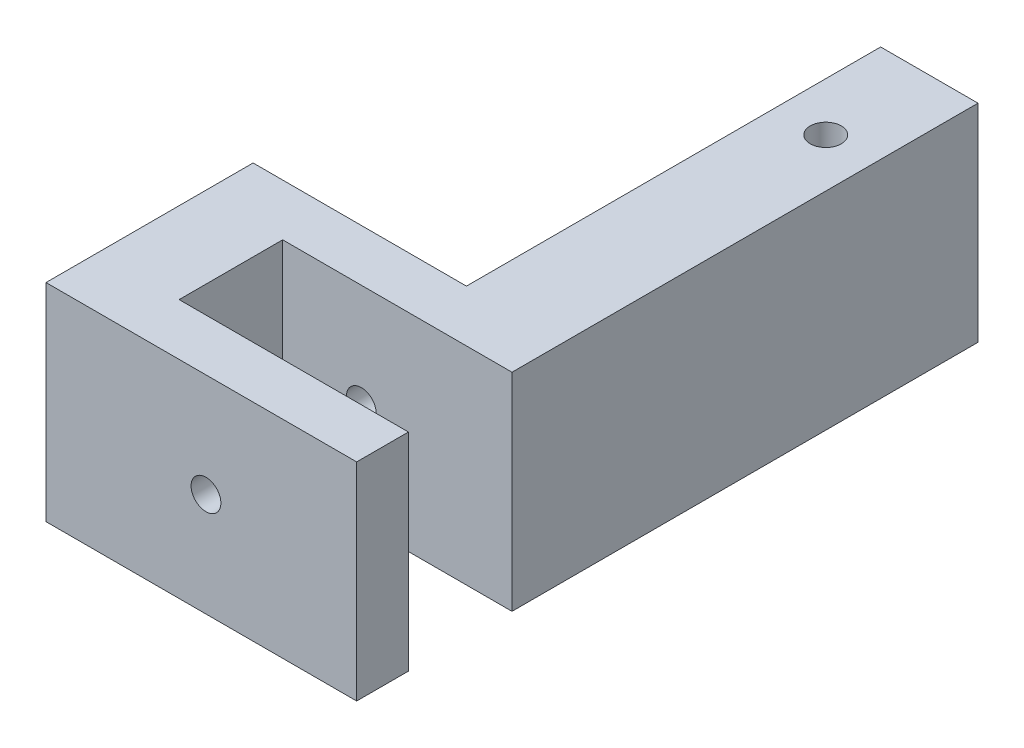
ISO-10303-21;
HEADER;
FILE_DESCRIPTION(('STEP AP214'),'2;1');
FILE_NAME('part.step','',(''),(''),'','','');
FILE_SCHEMA(('AUTOMOTIVE_DESIGN { 1 0 10303 214 1 1 1 1 }'));
ENDSEC;
DATA;
#1=APPLICATION_CONTEXT('core data for automotive mechanical design processes');
#2=APPLICATION_PROTOCOL_DEFINITION('international standard','automotive_design',2000,#1);
#3=PRODUCT_CONTEXT('',#1,'mechanical');
#4=PRODUCT('Part','Part','',(#3));
#5=PRODUCT_RELATED_PRODUCT_CATEGORY('part','',(#4));
#6=PRODUCT_DEFINITION_FORMATION('','',#4);
#7=PRODUCT_DEFINITION_CONTEXT('part definition',#1,'design');
#8=PRODUCT_DEFINITION('design','',#6,#7);
#9=PRODUCT_DEFINITION_SHAPE('','',#8);
#10=(LENGTH_UNIT() NAMED_UNIT(*) SI_UNIT(.MILLI.,.METRE.));
#11=(NAMED_UNIT(*) PLANE_ANGLE_UNIT() SI_UNIT($,.RADIAN.));
#12=(NAMED_UNIT(*) SI_UNIT($,.STERADIAN.) SOLID_ANGLE_UNIT());
#13=UNCERTAINTY_MEASURE_WITH_UNIT(LENGTH_MEASURE(1.E-05),#10,'distance_accuracy_value','');
#14=(GEOMETRIC_REPRESENTATION_CONTEXT(3) GLOBAL_UNCERTAINTY_ASSIGNED_CONTEXT((#13)) GLOBAL_UNIT_ASSIGNED_CONTEXT((#10,
#11,#12)) REPRESENTATION_CONTEXT('',''));
#15=CARTESIAN_POINT('',(0.,0.,0.));
#16=DIRECTION('',(0.,0.,1.));
#17=DIRECTION('',(1.,0.,0.));
#18=AXIS2_PLACEMENT_3D('',#15,#16,#17);
#19=CARTESIAN_POINT('',(0.,25.4,0.));
#20=DIRECTION('',(0.,1.,0.));
#21=DIRECTION('',(0.,0.,1.));
#22=AXIS2_PLACEMENT_3D('',#19,#20,#21);
#23=PLANE('',#22);
#24=DIRECTION('',(0.,0.,-1.));
#25=VECTOR('',#24,1.);
#26=CARTESIAN_POINT('',(0.,25.4,6.35));
#27=LINE('',#26,#25);
#28=CARTESIAN_POINT('',(0.,25.4,6.35));
#29=VERTEX_POINT('',#28);
#30=CARTESIAN_POINT('',(0.,25.4,0.));
#31=VERTEX_POINT('',#30);
#32=EDGE_CURVE('E182',#29,#31,#27,.T.);
#33=ORIENTED_EDGE('',*,*,#32,.T.);
#34=DIRECTION('',(-1.,0.,0.));
#35=VECTOR('',#34,1.);
#36=CARTESIAN_POINT('',(0.,25.4,0.));
#37=LINE('',#36,#35);
#38=CARTESIAN_POINT('',(-28.1242902208202,25.4,0.));
#39=VERTEX_POINT('',#38);
#40=EDGE_CURVE('E104',#31,#39,#37,.T.);
#41=ORIENTED_EDGE('',*,*,#40,.T.);
#42=DIRECTION('',(0.,0.,-1.));
#43=VECTOR('',#42,1.);
#44=CARTESIAN_POINT('',(-28.1242902208202,25.4,0.));
#45=LINE('',#44,#43);
#46=CARTESIAN_POINT('',(-28.1242902208202,25.4,-12.7));
#47=VERTEX_POINT('',#46);
#48=EDGE_CURVE('E211',#39,#47,#45,.T.);
#49=ORIENTED_EDGE('',*,*,#48,.T.);
#50=DIRECTION('',(1.,0.,0.));
#51=VECTOR('',#50,1.);
#52=CARTESIAN_POINT('',(-28.1242902208202,25.4,-12.7));
#53=LINE('',#52,#51);
#54=CARTESIAN_POINT('',(0.,25.4,-12.7));
#55=VERTEX_POINT('',#54);
#56=EDGE_CURVE('E230',#47,#55,#53,.T.);
#57=ORIENTED_EDGE('',*,*,#56,.T.);
#58=DIRECTION('',(0.,0.,-1.));
#59=VECTOR('',#58,1.);
#60=CARTESIAN_POINT('',(0.,25.4,-12.7));
#61=LINE('',#60,#59);
#62=CARTESIAN_POINT('',(0.,25.4,-69.85));
#63=VERTEX_POINT('',#62);
#64=EDGE_CURVE('E226',#55,#63,#61,.T.);
#65=ORIENTED_EDGE('',*,*,#64,.T.);
#66=DIRECTION('',(-1.,0.,0.));
#67=VECTOR('',#66,1.);
#68=CARTESIAN_POINT('',(-11.9388012618297,25.4,-69.85));
#69=LINE('',#68,#67);
#70=CARTESIAN_POINT('',(-11.9388012618297,25.4,-69.85));
#71=VERTEX_POINT('',#70);
#72=EDGE_CURVE('E229',#63,#71,#69,.T.);
#73=ORIENTED_EDGE('',*,*,#72,.T.);
#74=DIRECTION('',(0.,0.,1.));
#75=VECTOR('',#74,1.);
#76=CARTESIAN_POINT('',(-11.9388012618297,25.4,-19.05));
#77=LINE('',#76,#75);
#78=CARTESIAN_POINT('',(-11.9388012618297,25.4,-19.05));
#79=VERTEX_POINT('',#78);
#80=EDGE_CURVE('E129',#71,#79,#77,.T.);
#81=ORIENTED_EDGE('',*,*,#80,.T.);
#82=DIRECTION('',(-1.,0.,0.));
#83=VECTOR('',#82,1.);
#84=CARTESIAN_POINT('',(-38.1,25.4,-19.05));
#85=LINE('',#84,#83);
#86=CARTESIAN_POINT('',(-38.1,25.4,-19.05));
#87=VERTEX_POINT('',#86);
#88=EDGE_CURVE('E123',#79,#87,#85,.T.);
#89=ORIENTED_EDGE('',*,*,#88,.T.);
#90=DIRECTION('',(0.,0.,1.));
#91=VECTOR('',#90,1.);
#92=CARTESIAN_POINT('',(-38.1,25.4,-19.05));
#93=LINE('',#92,#91);
#94=CARTESIAN_POINT('',(-38.1,25.4,6.35));
#95=VERTEX_POINT('',#94);
#96=EDGE_CURVE('E127',#87,#95,#93,.T.);
#97=ORIENTED_EDGE('',*,*,#96,.T.);
#98=DIRECTION('',(1.,0.,0.));
#99=VECTOR('',#98,1.);
#100=CARTESIAN_POINT('',(-38.1,25.4,6.35));
#101=LINE('',#100,#99);
#102=EDGE_CURVE('E56',#95,#29,#101,.T.);
#103=ORIENTED_EDGE('',*,*,#102,.T.);
#104=EDGE_LOOP('',(#33,#41,#49,#57,#65,#73,#81,#89,#97,#103));
#105=FACE_BOUND('',#104,.T.);
#106=CARTESIAN_POINT('',(-5.96940063091483,25.4,-57.15));
#107=DIRECTION('',(0.,1.,0.));
#108=DIRECTION('',(0.,0.,1.));
#109=AXIS2_PLACEMENT_3D('',#106,#107,#108);
#110=CIRCLE('',#109,1.905);
#111=CARTESIAN_POINT('',(-5.96940063091483,25.4,-55.245));
#112=VERTEX_POINT('',#111);
#113=EDGE_CURVE('E157',#112,#112,#110,.T.);
#114=ORIENTED_EDGE('',*,*,#113,.F.);
#115=EDGE_LOOP('',(#114));
#116=FACE_BOUND('',#115,.T.);
#117=ADVANCED_FACE('F38',(#105,#116),#23,.T.);
#118=CARTESIAN_POINT('',(0.,0.,0.));
#119=DIRECTION('',(0.,1.,0.));
#120=DIRECTION('',(0.,0.,1.));
#121=AXIS2_PLACEMENT_3D('',#118,#119,#120);
#122=PLANE('',#121);
#123=DIRECTION('',(0.,0.,-1.));
#124=VECTOR('',#123,1.);
#125=CARTESIAN_POINT('',(0.,0.,6.35));
#126=LINE('',#125,#124);
#127=CARTESIAN_POINT('',(0.,0.,6.35));
#128=VERTEX_POINT('',#127);
#129=CARTESIAN_POINT('',(0.,0.,0.));
#130=VERTEX_POINT('',#129);
#131=EDGE_CURVE('E152',#128,#130,#126,.T.);
#132=ORIENTED_EDGE('',*,*,#131,.F.);
#133=DIRECTION('',(1.,0.,0.));
#134=VECTOR('',#133,1.);
#135=CARTESIAN_POINT('',(-38.1,0.,6.35));
#136=LINE('',#135,#134);
#137=CARTESIAN_POINT('',(-38.1,0.,6.35));
#138=VERTEX_POINT('',#137);
#139=EDGE_CURVE('E96',#138,#128,#136,.T.);
#140=ORIENTED_EDGE('',*,*,#139,.F.);
#141=DIRECTION('',(0.,0.,1.));
#142=VECTOR('',#141,1.);
#143=CARTESIAN_POINT('',(-38.1,0.,-7.03107255520506));
#144=LINE('',#143,#142);
#145=CARTESIAN_POINT('',(-38.1,0.,-19.05));
#146=VERTEX_POINT('',#145);
#147=EDGE_CURVE('E90',#146,#138,#144,.T.);
#148=ORIENTED_EDGE('',*,*,#147,.F.);
#149=DIRECTION('',(-1.,0.,0.));
#150=VECTOR('',#149,1.);
#151=CARTESIAN_POINT('',(-38.1,0.,-19.05));
#152=LINE('',#151,#150);
#153=CARTESIAN_POINT('',(-11.9388012618297,0.,-19.05));
#154=VERTEX_POINT('',#153);
#155=EDGE_CURVE('E139',#154,#146,#152,.T.);
#156=ORIENTED_EDGE('',*,*,#155,.F.);
#157=DIRECTION('',(0.,0.,1.));
#158=VECTOR('',#157,1.);
#159=CARTESIAN_POINT('',(-11.9388012618297,0.,-19.05));
#160=LINE('',#159,#158);
#161=CARTESIAN_POINT('',(-11.9388012618297,0.,-69.85));
#162=VERTEX_POINT('',#161);
#163=EDGE_CURVE('E173',#162,#154,#160,.T.);
#164=ORIENTED_EDGE('',*,*,#163,.F.);
#165=DIRECTION('',(-1.,0.,0.));
#166=VECTOR('',#165,1.);
#167=CARTESIAN_POINT('',(-11.9388012618297,0.,-69.85));
#168=LINE('',#167,#166);
#169=CARTESIAN_POINT('',(0.,0.,-69.85));
#170=VERTEX_POINT('',#169);
#171=EDGE_CURVE('E170',#170,#162,#168,.T.);
#172=ORIENTED_EDGE('',*,*,#171,.F.);
#173=DIRECTION('',(0.,0.,-1.));
#174=VECTOR('',#173,1.);
#175=CARTESIAN_POINT('',(0.,0.,-69.85));
#176=LINE('',#175,#174);
#177=CARTESIAN_POINT('',(0.,0.,-12.7));
#178=VERTEX_POINT('',#177);
#179=EDGE_CURVE('E167',#178,#170,#176,.T.);
#180=ORIENTED_EDGE('',*,*,#179,.F.);
#181=DIRECTION('',(1.,0.,0.));
#182=VECTOR('',#181,1.);
#183=CARTESIAN_POINT('',(-28.1242902208202,0.,-12.7));
#184=LINE('',#183,#182);
#185=CARTESIAN_POINT('',(-28.1242902208202,0.,-12.7));
#186=VERTEX_POINT('',#185);
#187=EDGE_CURVE('E163',#186,#178,#184,.T.);
#188=ORIENTED_EDGE('',*,*,#187,.F.);
#189=DIRECTION('',(0.,0.,-1.));
#190=VECTOR('',#189,1.);
#191=CARTESIAN_POINT('',(-28.1242902208202,0.,0.));
#192=LINE('',#191,#190);
#193=CARTESIAN_POINT('',(-28.1242902208202,0.,0.));
#194=VERTEX_POINT('',#193);
#195=EDGE_CURVE('E160',#194,#186,#192,.T.);
#196=ORIENTED_EDGE('',*,*,#195,.F.);
#197=DIRECTION('',(-1.,0.,0.));
#198=VECTOR('',#197,1.);
#199=CARTESIAN_POINT('',(0.,0.,0.));
#200=LINE('',#199,#198);
#201=EDGE_CURVE('E156',#130,#194,#200,.T.);
#202=ORIENTED_EDGE('',*,*,#201,.F.);
#203=EDGE_LOOP('',(#132,#140,#148,#156,#164,#172,#180,#188,#196,#202));
#204=FACE_BOUND('',#203,.T.);
#205=CARTESIAN_POINT('',(-5.96940063091483,0.,-57.15));
#206=DIRECTION('',(0.,1.,0.));
#207=DIRECTION('',(0.,0.,1.));
#208=AXIS2_PLACEMENT_3D('',#205,#206,#207);
#209=CIRCLE('',#208,1.905);
#210=CARTESIAN_POINT('',(-5.96940063091483,0.,-55.245));
#211=VERTEX_POINT('',#210);
#212=EDGE_CURVE('E244',#211,#211,#209,.T.);
#213=ORIENTED_EDGE('',*,*,#212,.T.);
#214=EDGE_LOOP('',(#213));
#215=FACE_BOUND('',#214,.T.);
#216=ADVANCED_FACE('F215',(#204,#215),#122,.F.);
#217=CARTESIAN_POINT('',(0.,25.4,6.35));
#218=DIRECTION('',(-1.,0.,0.));
#219=DIRECTION('',(0.,0.,1.));
#220=AXIS2_PLACEMENT_3D('',#217,#218,#219);
#221=PLANE('',#220);
#222=ORIENTED_EDGE('',*,*,#131,.T.);
#223=DIRECTION('',(0.,-1.,0.));
#224=VECTOR('',#223,1.);
#225=CARTESIAN_POINT('',(0.,25.4,0.));
#226=LINE('',#225,#224);
#227=EDGE_CURVE('E11',#31,#130,#226,.T.);
#228=ORIENTED_EDGE('',*,*,#227,.F.);
#229=ORIENTED_EDGE('',*,*,#32,.F.);
#230=DIRECTION('',(0.,-1.,0.));
#231=VECTOR('',#230,1.);
#232=CARTESIAN_POINT('',(0.,25.4,6.35));
#233=LINE('',#232,#231);
#234=EDGE_CURVE('E148',#29,#128,#233,.T.);
#235=ORIENTED_EDGE('',*,*,#234,.T.);
#236=EDGE_LOOP('',(#222,#228,#229,#235));
#237=FACE_BOUND('',#236,.T.);
#238=ADVANCED_FACE('F40',(#237),#221,.F.);
#239=CARTESIAN_POINT('',(0.,25.4,0.));
#240=DIRECTION('',(0.,0.,1.));
#241=DIRECTION('',(1.,0.,0.));
#242=AXIS2_PLACEMENT_3D('',#239,#240,#241);
#243=PLANE('',#242);
#244=CARTESIAN_POINT('',(-18.4791009463723,12.7,0.));
#245=DIRECTION('',(0.,0.,1.));
#246=DIRECTION('',(1.,0.,0.));
#247=AXIS2_PLACEMENT_3D('',#244,#245,#246);
#248=CIRCLE('',#247,1.82879999999999);
#249=CARTESIAN_POINT('',(-16.6503009463723,12.7,0.));
#250=VERTEX_POINT('',#249);
#251=EDGE_CURVE('E248',#250,#250,#248,.T.);
#252=ORIENTED_EDGE('',*,*,#251,.T.);
#253=EDGE_LOOP('',(#252));
#254=FACE_BOUND('',#253,.T.);
#255=ORIENTED_EDGE('',*,*,#201,.T.);
#256=DIRECTION('',(0.,-1.,0.));
#257=VECTOR('',#256,1.);
#258=CARTESIAN_POINT('',(-28.1242902208202,25.4,0.));
#259=LINE('',#258,#257);
#260=EDGE_CURVE('E48',#39,#194,#259,.T.);
#261=ORIENTED_EDGE('',*,*,#260,.F.);
#262=ORIENTED_EDGE('',*,*,#40,.F.);
#263=ORIENTED_EDGE('',*,*,#227,.T.);
#264=EDGE_LOOP('',(#255,#261,#262,#263));
#265=FACE_BOUND('',#264,.T.);
#266=ADVANCED_FACE('F310',(#254,#265),#243,.F.);
#267=CARTESIAN_POINT('',(-28.1242902208202,25.4,0.));
#268=DIRECTION('',(-1.,0.,0.));
#269=DIRECTION('',(0.,0.,1.));
#270=AXIS2_PLACEMENT_3D('',#267,#268,#269);
#271=PLANE('',#270);
#272=ORIENTED_EDGE('',*,*,#195,.T.);
#273=DIRECTION('',(0.,-1.,0.));
#274=VECTOR('',#273,1.);
#275=CARTESIAN_POINT('',(-28.1242902208202,25.4,-12.7));
#276=LINE('',#275,#274);
#277=EDGE_CURVE('E201',#47,#186,#276,.T.);
#278=ORIENTED_EDGE('',*,*,#277,.F.);
#279=ORIENTED_EDGE('',*,*,#48,.F.);
#280=ORIENTED_EDGE('',*,*,#260,.T.);
#281=EDGE_LOOP('',(#272,#278,#279,#280));
#282=FACE_BOUND('',#281,.T.);
#283=ADVANCED_FACE('F209',(#282),#271,.F.);
#284=CARTESIAN_POINT('',(-28.1242902208202,25.4,-12.7));
#285=DIRECTION('',(0.,0.,-1.));
#286=DIRECTION('',(-1.,0.,0.));
#287=AXIS2_PLACEMENT_3D('',#284,#285,#286);
#288=PLANE('',#287);
#289=CARTESIAN_POINT('',(-18.4791009463723,12.7,-12.7));
#290=DIRECTION('',(0.,0.,-1.));
#291=DIRECTION('',(-1.,0.,0.));
#292=AXIS2_PLACEMENT_3D('',#289,#290,#291);
#293=CIRCLE('',#292,1.82879999999999);
#294=CARTESIAN_POINT('',(-20.3079009463722,12.7,-12.7));
#295=VERTEX_POINT('',#294);
#296=EDGE_CURVE('E255',#295,#295,#293,.T.);
#297=ORIENTED_EDGE('',*,*,#296,.T.);
#298=EDGE_LOOP('',(#297));
#299=FACE_BOUND('',#298,.T.);
#300=ORIENTED_EDGE('',*,*,#187,.T.);
#301=DIRECTION('',(0.,-1.,0.));
#302=VECTOR('',#301,1.);
#303=CARTESIAN_POINT('',(0.,25.4,-12.7));
#304=LINE('',#303,#302);
#305=EDGE_CURVE('E197',#55,#178,#304,.T.);
#306=ORIENTED_EDGE('',*,*,#305,.F.);
#307=ORIENTED_EDGE('',*,*,#56,.F.);
#308=ORIENTED_EDGE('',*,*,#277,.T.);
#309=EDGE_LOOP('',(#300,#306,#307,#308));
#310=FACE_BOUND('',#309,.T.);
#311=ADVANCED_FACE('F220',(#299,#310),#288,.F.);
#312=CARTESIAN_POINT('',(0.,25.4,-69.85));
#313=DIRECTION('',(-1.,0.,0.));
#314=DIRECTION('',(0.,0.,1.));
#315=AXIS2_PLACEMENT_3D('',#312,#313,#314);
#316=PLANE('',#315);
#317=ORIENTED_EDGE('',*,*,#179,.T.);
#318=DIRECTION('',(0.,-1.,0.));
#319=VECTOR('',#318,1.);
#320=CARTESIAN_POINT('',(0.,25.4,-69.85));
#321=LINE('',#320,#319);
#322=EDGE_CURVE('E193',#63,#170,#321,.T.);
#323=ORIENTED_EDGE('',*,*,#322,.F.);
#324=ORIENTED_EDGE('',*,*,#64,.F.);
#325=ORIENTED_EDGE('',*,*,#305,.T.);
#326=EDGE_LOOP('',(#317,#323,#324,#325));
#327=FACE_BOUND('',#326,.T.);
#328=ADVANCED_FACE('F224',(#327),#316,.F.);
#329=CARTESIAN_POINT('',(-11.9388012618297,25.4,-69.85));
#330=DIRECTION('',(0.,0.,1.));
#331=DIRECTION('',(1.,0.,0.));
#332=AXIS2_PLACEMENT_3D('',#329,#330,#331);
#333=PLANE('',#332);
#334=ORIENTED_EDGE('',*,*,#171,.T.);
#335=DIRECTION('',(0.,-1.,0.));
#336=VECTOR('',#335,1.);
#337=CARTESIAN_POINT('',(-11.9388012618297,25.4,-69.85));
#338=LINE('',#337,#336);
#339=EDGE_CURVE('E189',#71,#162,#338,.T.);
#340=ORIENTED_EDGE('',*,*,#339,.F.);
#341=ORIENTED_EDGE('',*,*,#72,.F.);
#342=ORIENTED_EDGE('',*,*,#322,.T.);
#343=EDGE_LOOP('',(#334,#340,#341,#342));
#344=FACE_BOUND('',#343,.T.);
#345=ADVANCED_FACE('F283',(#344),#333,.F.);
#346=CARTESIAN_POINT('',(-11.9388012618297,25.4,-19.05));
#347=DIRECTION('',(1.,0.,0.));
#348=DIRECTION('',(0.,0.,-1.));
#349=AXIS2_PLACEMENT_3D('',#346,#347,#348);
#350=PLANE('',#349);
#351=ORIENTED_EDGE('',*,*,#163,.T.);
#352=DIRECTION('',(0.,-1.,0.));
#353=VECTOR('',#352,1.);
#354=CARTESIAN_POINT('',(-11.9388012618297,25.4,-19.05));
#355=LINE('',#354,#353);
#356=EDGE_CURVE('E141',#79,#154,#355,.T.);
#357=ORIENTED_EDGE('',*,*,#356,.F.);
#358=ORIENTED_EDGE('',*,*,#80,.F.);
#359=ORIENTED_EDGE('',*,*,#339,.T.);
#360=EDGE_LOOP('',(#351,#357,#358,#359));
#361=FACE_BOUND('',#360,.T.);
#362=ADVANCED_FACE('F275',(#361),#350,.F.);
#363=CARTESIAN_POINT('',(-38.1,25.4,-19.05));
#364=DIRECTION('',(0.,0.,1.));
#365=DIRECTION('',(1.,0.,0.));
#366=AXIS2_PLACEMENT_3D('',#363,#364,#365);
#367=PLANE('',#366);
#368=CARTESIAN_POINT('',(-18.4791009463723,12.7,-19.05));
#369=DIRECTION('',(0.,0.,-1.));
#370=DIRECTION('',(-1.,0.,0.));
#371=AXIS2_PLACEMENT_3D('',#368,#369,#370);
#372=CIRCLE('',#371,3.5433);
#373=CARTESIAN_POINT('',(-22.0224009463723,12.7,-19.05));
#374=VERTEX_POINT('',#373);
#375=EDGE_CURVE('E267',#374,#374,#372,.T.);
#376=ORIENTED_EDGE('',*,*,#375,.F.);
#377=EDGE_LOOP('',(#376));
#378=FACE_BOUND('',#377,.T.);
#379=ORIENTED_EDGE('',*,*,#155,.T.);
#380=DIRECTION('',(0.,-1.,0.));
#381=VECTOR('',#380,1.);
#382=CARTESIAN_POINT('',(-38.1,25.4,-19.05));
#383=LINE('',#382,#381);
#384=EDGE_CURVE('E136',#87,#146,#383,.T.);
#385=ORIENTED_EDGE('',*,*,#384,.F.);
#386=ORIENTED_EDGE('',*,*,#88,.F.);
#387=ORIENTED_EDGE('',*,*,#356,.T.);
#388=EDGE_LOOP('',(#379,#385,#386,#387));
#389=FACE_BOUND('',#388,.T.);
#390=ADVANCED_FACE('F137',(#378,#389),#367,.F.);
#391=CARTESIAN_POINT('',(-38.1,25.4,-7.03107255520506));
#392=DIRECTION('',(1.,0.,0.));
#393=DIRECTION('',(0.,0.,-1.));
#394=AXIS2_PLACEMENT_3D('',#391,#392,#393);
#395=PLANE('',#394);
#396=ORIENTED_EDGE('',*,*,#147,.T.);
#397=DIRECTION('',(0.,-1.,0.));
#398=VECTOR('',#397,1.);
#399=CARTESIAN_POINT('',(-38.1,25.4,6.35));
#400=LINE('',#399,#398);
#401=EDGE_CURVE('E142',#95,#138,#400,.T.);
#402=ORIENTED_EDGE('',*,*,#401,.F.);
#403=ORIENTED_EDGE('',*,*,#96,.F.);
#404=ORIENTED_EDGE('',*,*,#384,.T.);
#405=EDGE_LOOP('',(#396,#402,#403,#404));
#406=FACE_BOUND('',#405,.T.);
#407=ADVANCED_FACE('F144',(#406),#395,.F.);
#408=CARTESIAN_POINT('',(-38.1,25.4,6.35));
#409=DIRECTION('',(0.,0.,-1.));
#410=DIRECTION('',(-1.,0.,0.));
#411=AXIS2_PLACEMENT_3D('',#408,#409,#410);
#412=PLANE('',#411);
#413=CARTESIAN_POINT('',(-18.4791009463723,12.7,6.35));
#414=DIRECTION('',(0.,0.,-1.));
#415=DIRECTION('',(-1.,0.,0.));
#416=AXIS2_PLACEMENT_3D('',#413,#414,#415);
#417=CIRCLE('',#416,1.82879999999999);
#418=CARTESIAN_POINT('',(-20.3079009463722,12.7,6.35));
#419=VERTEX_POINT('',#418);
#420=EDGE_CURVE('E259',#419,#419,#417,.T.);
#421=ORIENTED_EDGE('',*,*,#420,.T.);
#422=EDGE_LOOP('',(#421));
#423=FACE_BOUND('',#422,.T.);
#424=ORIENTED_EDGE('',*,*,#139,.T.);
#425=ORIENTED_EDGE('',*,*,#234,.F.);
#426=ORIENTED_EDGE('',*,*,#102,.F.);
#427=ORIENTED_EDGE('',*,*,#401,.T.);
#428=EDGE_LOOP('',(#424,#425,#426,#427));
#429=FACE_BOUND('',#428,.T.);
#430=ADVANCED_FACE('F281',(#423,#429),#412,.F.);
#431=CARTESIAN_POINT('',(-5.96940063091483,25.4,-57.15));
#432=DIRECTION('',(0.,-1.,0.));
#433=DIRECTION('',(0.,0.,-1.));
#434=AXIS2_PLACEMENT_3D('',#431,#432,#433);
#435=CYLINDRICAL_SURFACE('',#434,1.905);
#436=ORIENTED_EDGE('',*,*,#113,.T.);
#437=EDGE_LOOP('',(#436));
#438=FACE_BOUND('',#437,.T.);
#439=ORIENTED_EDGE('',*,*,#212,.F.);
#440=EDGE_LOOP('',(#439));
#441=FACE_BOUND('',#440,.T.);
#442=ADVANCED_FACE('F293',(#438,#441),#435,.F.);
#443=CARTESIAN_POINT('',(-18.4791009463723,12.7,-19.05));
#444=DIRECTION('',(0.,0.,-1.));
#445=DIRECTION('',(-1.,0.,0.));
#446=AXIS2_PLACEMENT_3D('',#443,#444,#445);
#447=CONICAL_SURFACE('',#446,3.5433,0.715584993317676);
#448=CARTESIAN_POINT('',(-18.4791009463723,12.7,-17.0776933658196));
#449=DIRECTION('',(0.,0.,-1.));
#450=DIRECTION('',(-1.,0.,0.));
#451=AXIS2_PLACEMENT_3D('',#448,#449,#450);
#452=CIRCLE('',#451,1.82879999999999);
#453=CARTESIAN_POINT('',(-20.3079009463722,12.7,-17.0776933658196));
#454=VERTEX_POINT('',#453);
#455=EDGE_CURVE('E263',#454,#454,#452,.T.);
#456=ORIENTED_EDGE('',*,*,#455,.F.);
#457=EDGE_LOOP('',(#456));
#458=FACE_BOUND('',#457,.T.);
#459=ORIENTED_EDGE('',*,*,#375,.T.);
#460=EDGE_LOOP('',(#459));
#461=FACE_BOUND('',#460,.T.);
#462=ADVANCED_FACE('F272',(#458,#461),#447,.F.);
#463=CARTESIAN_POINT('',(-18.4791009463723,12.7,-19.05));
#464=DIRECTION('',(0.,0.,-1.));
#465=DIRECTION('',(-1.,0.,0.));
#466=AXIS2_PLACEMENT_3D('',#463,#464,#465);
#467=CYLINDRICAL_SURFACE('',#466,1.82879999999999);
#468=ORIENTED_EDGE('',*,*,#455,.T.);
#469=EDGE_LOOP('',(#468));
#470=FACE_BOUND('',#469,.T.);
#471=ORIENTED_EDGE('',*,*,#296,.F.);
#472=EDGE_LOOP('',(#471));
#473=FACE_BOUND('',#472,.T.);
#474=ADVANCED_FACE('F307',(#470,#473),#467,.F.);
#475=ORIENTED_EDGE('',*,*,#420,.F.);
#476=EDGE_LOOP('',(#475));
#477=FACE_BOUND('',#476,.T.);
#478=ORIENTED_EDGE('',*,*,#251,.F.);
#479=EDGE_LOOP('',(#478));
#480=FACE_BOUND('',#479,.T.);
#481=ADVANCED_FACE('F304',(#477,#480),#467,.F.);
#482=CLOSED_SHELL('',(#117,#216,#238,#266,#283,#311,#328,#345,#362,#390,#407,#430,#442,#462,
#474,#481));
#483=MANIFOLD_SOLID_BREP('B2',#482);
#484=ADVANCED_BREP_SHAPE_REPRESENTATION('',(#18,#483),#14);
#485=SHAPE_DEFINITION_REPRESENTATION(#9,#484);
ENDSEC;
END-ISO-10303-21;
